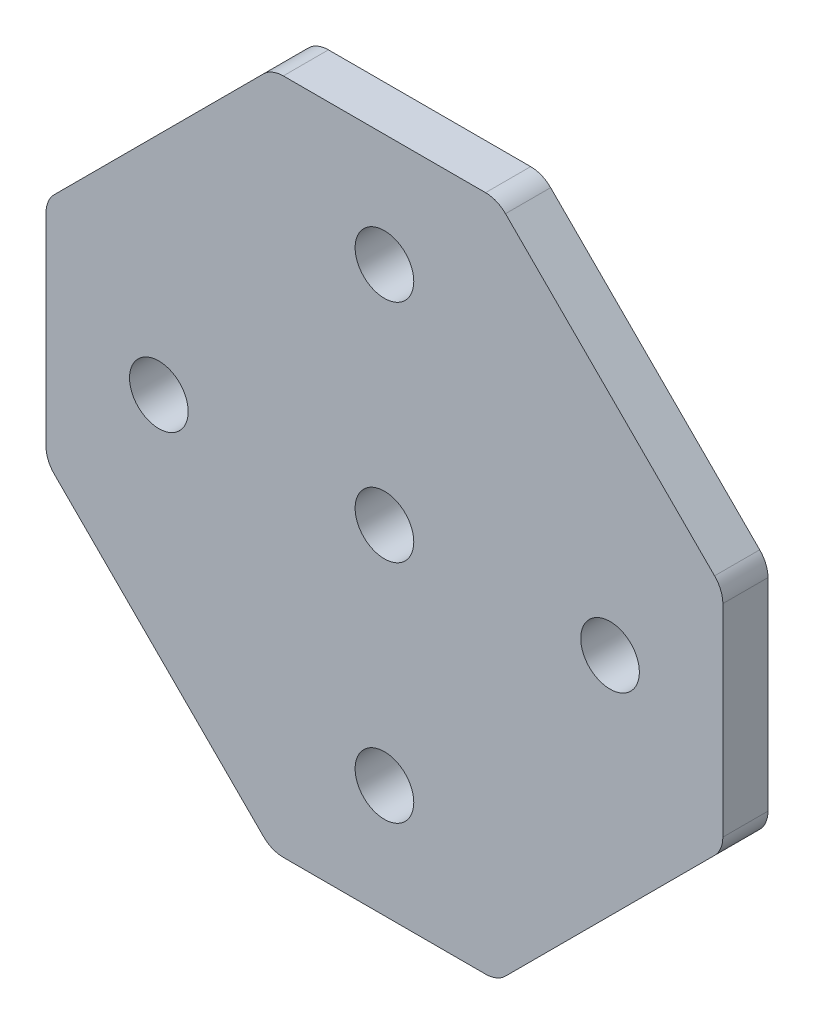
ISO-10303-21;
HEADER;
FILE_DESCRIPTION(('STEP AP214'),'2;1');
FILE_NAME('part.step','',(''),(''),'','','');
FILE_SCHEMA(('AUTOMOTIVE_DESIGN { 1 0 10303 214 1 1 1 1 }'));
ENDSEC;
DATA;
#1=APPLICATION_CONTEXT('core data for automotive mechanical design processes');
#2=APPLICATION_PROTOCOL_DEFINITION('international standard','automotive_design',2000,#1);
#3=PRODUCT_CONTEXT('',#1,'mechanical');
#4=PRODUCT('Part','Part','',(#3));
#5=PRODUCT_RELATED_PRODUCT_CATEGORY('part','',(#4));
#6=PRODUCT_DEFINITION_FORMATION('','',#4);
#7=PRODUCT_DEFINITION_CONTEXT('part definition',#1,'design');
#8=PRODUCT_DEFINITION('design','',#6,#7);
#9=PRODUCT_DEFINITION_SHAPE('','',#8);
#10=(LENGTH_UNIT() NAMED_UNIT(*) SI_UNIT(.MILLI.,.METRE.));
#11=(NAMED_UNIT(*) PLANE_ANGLE_UNIT() SI_UNIT($,.RADIAN.));
#12=(NAMED_UNIT(*) SI_UNIT($,.STERADIAN.) SOLID_ANGLE_UNIT());
#13=UNCERTAINTY_MEASURE_WITH_UNIT(LENGTH_MEASURE(1.E-05),#10,'distance_accuracy_value','');
#14=(GEOMETRIC_REPRESENTATION_CONTEXT(3) GLOBAL_UNCERTAINTY_ASSIGNED_CONTEXT((#13)) GLOBAL_UNIT_ASSIGNED_CONTEXT((#10,
#11,#12)) REPRESENTATION_CONTEXT('',''));
#15=CARTESIAN_POINT('',(0.,0.,0.));
#16=DIRECTION('',(0.,0.,1.));
#17=DIRECTION('',(1.,0.,0.));
#18=AXIS2_PLACEMENT_3D('',#15,#16,#17);
#19=CARTESIAN_POINT('',(2.5,1.03553390593274,4.));
#20=DIRECTION('',(0.,0.,1.));
#21=DIRECTION('',(1.,0.,0.));
#22=AXIS2_PLACEMENT_3D('',#19,#20,#21);
#23=PLANE('',#22);
#24=CARTESIAN_POINT('',(29.9999999999999,30.,4.));
#25=DIRECTION('',(0.,0.,1.));
#26=DIRECTION('',(1.,0.,0.));
#27=AXIS2_PLACEMENT_3D('',#24,#25,#26);
#28=CIRCLE('',#27,2.6);
#29=CARTESIAN_POINT('',(32.5999999999999,30.,4.));
#30=VERTEX_POINT('',#29);
#31=EDGE_CURVE('E400',#30,#30,#28,.T.);
#32=ORIENTED_EDGE('',*,*,#31,.F.);
#33=EDGE_LOOP('',(#32));
#34=FACE_BOUND('',#33,.T.);
#35=CARTESIAN_POINT('',(10.,10.,4.));
#36=DIRECTION('',(0.,0.,1.));
#37=DIRECTION('',(1.,0.,0.));
#38=AXIS2_PLACEMENT_3D('',#35,#36,#37);
#39=CIRCLE('',#38,2.6);
#40=CARTESIAN_POINT('',(12.6,10.,4.));
#41=VERTEX_POINT('',#40);
#42=EDGE_CURVE('E416',#41,#41,#39,.T.);
#43=ORIENTED_EDGE('',*,*,#42,.F.);
#44=EDGE_LOOP('',(#43));
#45=FACE_BOUND('',#44,.T.);
#46=CARTESIAN_POINT('',(2.5,1.03553390593274,4.));
#47=DIRECTION('',(0.,0.,1.));
#48=DIRECTION('',(1.,0.,0.));
#49=AXIS2_PLACEMENT_3D('',#46,#47,#48);
#50=CIRCLE('',#49,2.49999999999999);
#51=CARTESIAN_POINT('',(0.,1.03553390593276,4.));
#52=VERTEX_POINT('',#51);
#53=CARTESIAN_POINT('',(0.732233047033648,-0.732233047033627,4.));
#54=VERTEX_POINT('',#53);
#55=EDGE_CURVE('E236',#52,#54,#50,.T.);
#56=ORIENTED_EDGE('',*,*,#55,.T.);
#57=DIRECTION('',(0.707106781186555,-0.70710678118654,0.));
#58=VECTOR('',#57,1.);
#59=CARTESIAN_POINT('',(19.2677669529668,-19.2677669529664,4.));
#60=LINE('',#59,#58);
#61=CARTESIAN_POINT('',(19.2677669529667,-19.2677669529665,4.));
#62=VERTEX_POINT('',#61);
#63=EDGE_CURVE('E124',#54,#62,#60,.T.);
#64=ORIENTED_EDGE('',*,*,#63,.T.);
#65=CARTESIAN_POINT('',(21.0355339059327,-17.5,4.));
#66=DIRECTION('',(0.,0.,1.));
#67=DIRECTION('',(-1.,0.,0.));
#68=AXIS2_PLACEMENT_3D('',#65,#66,#67);
#69=CIRCLE('',#68,2.49999999999985);
#70=CARTESIAN_POINT('',(21.0355339059331,-20.,4.));
#71=VERTEX_POINT('',#70);
#72=EDGE_CURVE('E289',#62,#71,#69,.T.);
#73=ORIENTED_EDGE('',*,*,#72,.T.);
#74=DIRECTION('',(1.,0.,0.));
#75=VECTOR('',#74,1.);
#76=CARTESIAN_POINT('',(38.9644660940673,-20.,4.));
#77=LINE('',#76,#75);
#78=CARTESIAN_POINT('',(38.9644660940673,-20.,4.));
#79=VERTEX_POINT('',#78);
#80=EDGE_CURVE('E309',#71,#79,#77,.T.);
#81=ORIENTED_EDGE('',*,*,#80,.T.);
#82=CARTESIAN_POINT('',(38.9644660940673,-17.5,4.));
#83=DIRECTION('',(0.,0.,1.));
#84=DIRECTION('',(-1.,0.,0.));
#85=AXIS2_PLACEMENT_3D('',#82,#83,#84);
#86=CIRCLE('',#85,2.5);
#87=CARTESIAN_POINT('',(40.7322330470336,-19.2677669529664,4.));
#88=VERTEX_POINT('',#87);
#89=EDGE_CURVE('E305',#79,#88,#86,.T.);
#90=ORIENTED_EDGE('',*,*,#89,.T.);
#91=DIRECTION('',(0.707106781186548,0.707106781186547,0.));
#92=VECTOR('',#91,1.);
#93=CARTESIAN_POINT('',(59.2677669529664,-0.732233047033638,4.));
#94=LINE('',#93,#92);
#95=CARTESIAN_POINT('',(59.2677669529664,-0.732233047033639,4.));
#96=VERTEX_POINT('',#95);
#97=EDGE_CURVE('E308',#88,#96,#94,.T.);
#98=ORIENTED_EDGE('',*,*,#97,.T.);
#99=CARTESIAN_POINT('',(57.5,1.03553390593274,4.));
#100=DIRECTION('',(0.,0.,1.));
#101=DIRECTION('',(-1.,0.,0.));
#102=AXIS2_PLACEMENT_3D('',#99,#100,#101);
#103=CIRCLE('',#102,2.5);
#104=CARTESIAN_POINT('',(60.,1.03553390593275,4.));
#105=VERTEX_POINT('',#104);
#106=EDGE_CURVE('E313',#96,#105,#103,.T.);
#107=ORIENTED_EDGE('',*,*,#106,.T.);
#108=DIRECTION('',(0.,1.,0.));
#109=VECTOR('',#108,1.);
#110=CARTESIAN_POINT('',(60.,18.9644660940673,4.));
#111=LINE('',#110,#109);
#112=CARTESIAN_POINT('',(60.,18.9644660940673,4.));
#113=VERTEX_POINT('',#112);
#114=EDGE_CURVE('E320',#105,#113,#111,.T.);
#115=ORIENTED_EDGE('',*,*,#114,.T.);
#116=CARTESIAN_POINT('',(57.5,18.9644660940673,4.));
#117=DIRECTION('',(0.,0.,1.));
#118=DIRECTION('',(-1.,0.,0.));
#119=AXIS2_PLACEMENT_3D('',#116,#117,#118);
#120=CIRCLE('',#119,2.5);
#121=CARTESIAN_POINT('',(59.2677669529664,20.7322330470336,4.));
#122=VERTEX_POINT('',#121);
#123=EDGE_CURVE('E323',#113,#122,#120,.T.);
#124=ORIENTED_EDGE('',*,*,#123,.T.);
#125=DIRECTION('',(-0.707106781186547,0.707106781186547,0.));
#126=VECTOR('',#125,1.);
#127=CARTESIAN_POINT('',(40.7322330470336,39.2677669529664,4.));
#128=LINE('',#127,#126);
#129=CARTESIAN_POINT('',(40.7322330470336,39.2677669529664,4.));
#130=VERTEX_POINT('',#129);
#131=EDGE_CURVE('E326',#122,#130,#128,.T.);
#132=ORIENTED_EDGE('',*,*,#131,.T.);
#133=CARTESIAN_POINT('',(38.9644660940673,37.5,4.));
#134=DIRECTION('',(0.,0.,1.));
#135=DIRECTION('',(-1.,0.,0.));
#136=AXIS2_PLACEMENT_3D('',#133,#134,#135);
#137=CIRCLE('',#136,2.5);
#138=CARTESIAN_POINT('',(38.9644660940673,40.,4.));
#139=VERTEX_POINT('',#138);
#140=EDGE_CURVE('E329',#130,#139,#137,.T.);
#141=ORIENTED_EDGE('',*,*,#140,.T.);
#142=DIRECTION('',(-1.,0.,0.));
#143=VECTOR('',#142,1.);
#144=CARTESIAN_POINT('',(21.0355339059331,40.,4.));
#145=LINE('',#144,#143);
#146=CARTESIAN_POINT('',(21.0355339059331,39.9999999999999,4.));
#147=VERTEX_POINT('',#146);
#148=EDGE_CURVE('E332',#139,#147,#145,.T.);
#149=ORIENTED_EDGE('',*,*,#148,.T.);
#150=CARTESIAN_POINT('',(21.0355339059327,37.5,4.));
#151=DIRECTION('',(0.,0.,1.));
#152=DIRECTION('',(-1.,0.,0.));
#153=AXIS2_PLACEMENT_3D('',#150,#151,#152);
#154=CIRCLE('',#153,2.49999999999986);
#155=CARTESIAN_POINT('',(19.2677669529668,39.2677669529664,4.));
#156=VERTEX_POINT('',#155);
#157=EDGE_CURVE('E167',#147,#156,#154,.T.);
#158=ORIENTED_EDGE('',*,*,#157,.T.);
#159=DIRECTION('',(-0.707106781186555,-0.70710678118654,0.));
#160=VECTOR('',#159,1.);
#161=CARTESIAN_POINT('',(0.73223304703365,20.7322330470336,4.));
#162=LINE('',#161,#160);
#163=CARTESIAN_POINT('',(0.73223304703365,20.7322330470336,4.));
#164=VERTEX_POINT('',#163);
#165=EDGE_CURVE('E161',#156,#164,#162,.T.);
#166=ORIENTED_EDGE('',*,*,#165,.T.);
#167=CARTESIAN_POINT('',(2.5,18.9644660940673,4.));
#168=DIRECTION('',(0.,0.,1.));
#169=DIRECTION('',(-1.,0.,0.));
#170=AXIS2_PLACEMENT_3D('',#167,#168,#169);
#171=CIRCLE('',#170,2.5);
#172=CARTESIAN_POINT('',(0.,18.9644660940673,4.));
#173=VERTEX_POINT('',#172);
#174=EDGE_CURVE('E165',#164,#173,#171,.T.);
#175=ORIENTED_EDGE('',*,*,#174,.T.);
#176=DIRECTION('',(0.,-1.,0.));
#177=VECTOR('',#176,1.);
#178=CARTESIAN_POINT('',(0.,1.03553390593276,4.));
#179=LINE('',#178,#177);
#180=EDGE_CURVE('E57',#173,#52,#179,.T.);
#181=ORIENTED_EDGE('',*,*,#180,.T.);
#182=EDGE_LOOP('',(#56,#64,#73,#81,#90,#98,#107,#115,#124,#132,#141,#149,#158,#166,#175,#181));
#183=FACE_BOUND('',#182,.T.);
#184=CARTESIAN_POINT('',(30.,10.,4.));
#185=DIRECTION('',(0.,0.,1.));
#186=DIRECTION('',(1.,0.,0.));
#187=AXIS2_PLACEMENT_3D('',#184,#185,#186);
#188=CIRCLE('',#187,2.6);
#189=CARTESIAN_POINT('',(32.6,10.,4.));
#190=VERTEX_POINT('',#189);
#191=EDGE_CURVE('E194',#190,#190,#188,.T.);
#192=ORIENTED_EDGE('',*,*,#191,.F.);
#193=EDGE_LOOP('',(#192));
#194=FACE_BOUND('',#193,.T.);
#195=CARTESIAN_POINT('',(50.,10.,4.));
#196=DIRECTION('',(0.,0.,1.));
#197=DIRECTION('',(1.,0.,0.));
#198=AXIS2_PLACEMENT_3D('',#195,#196,#197);
#199=CIRCLE('',#198,2.6);
#200=CARTESIAN_POINT('',(52.6,10.,4.));
#201=VERTEX_POINT('',#200);
#202=EDGE_CURVE('E408',#201,#201,#199,.T.);
#203=ORIENTED_EDGE('',*,*,#202,.F.);
#204=EDGE_LOOP('',(#203));
#205=FACE_BOUND('',#204,.T.);
#206=CARTESIAN_POINT('',(30.0000000000002,-10.,4.));
#207=DIRECTION('',(0.,0.,1.));
#208=DIRECTION('',(1.,0.,0.));
#209=AXIS2_PLACEMENT_3D('',#206,#207,#208);
#210=CIRCLE('',#209,2.6);
#211=CARTESIAN_POINT('',(32.6000000000002,-10.,4.));
#212=VERTEX_POINT('',#211);
#213=EDGE_CURVE('E389',#212,#212,#210,.T.);
#214=ORIENTED_EDGE('',*,*,#213,.F.);
#215=EDGE_LOOP('',(#214));
#216=FACE_BOUND('',#215,.T.);
#217=ADVANCED_FACE('F39',(#34,#45,#183,#194,#205,#216),#23,.T.);
#218=CARTESIAN_POINT('',(2.5,1.03553390593274,0.));
#219=DIRECTION('',(0.,0.,1.));
#220=DIRECTION('',(1.,0.,0.));
#221=AXIS2_PLACEMENT_3D('',#218,#219,#220);
#222=PLANE('',#221);
#223=CARTESIAN_POINT('',(2.5,1.03553390593274,0.));
#224=DIRECTION('',(0.,0.,1.));
#225=DIRECTION('',(1.,0.,0.));
#226=AXIS2_PLACEMENT_3D('',#223,#224,#225);
#227=CIRCLE('',#226,2.49999999999999);
#228=CARTESIAN_POINT('',(0.,1.03553390593276,0.));
#229=VERTEX_POINT('',#228);
#230=CARTESIAN_POINT('',(0.732233047033648,-0.732233047033627,0.));
#231=VERTEX_POINT('',#230);
#232=EDGE_CURVE('E189',#229,#231,#227,.T.);
#233=ORIENTED_EDGE('',*,*,#232,.F.);
#234=DIRECTION('',(0.,-1.,0.));
#235=VECTOR('',#234,1.);
#236=CARTESIAN_POINT('',(0.,1.03553390593276,0.));
#237=LINE('',#236,#235);
#238=CARTESIAN_POINT('',(0.,18.9644660940673,0.));
#239=VERTEX_POINT('',#238);
#240=EDGE_CURVE('E116',#239,#229,#237,.T.);
#241=ORIENTED_EDGE('',*,*,#240,.F.);
#242=CARTESIAN_POINT('',(2.5,18.9644660940673,0.));
#243=DIRECTION('',(0.,0.,1.));
#244=DIRECTION('',(-1.,0.,0.));
#245=AXIS2_PLACEMENT_3D('',#242,#243,#244);
#246=CIRCLE('',#245,2.5);
#247=CARTESIAN_POINT('',(0.73223304703365,20.7322330470336,0.));
#248=VERTEX_POINT('',#247);
#249=EDGE_CURVE('E110',#248,#239,#246,.T.);
#250=ORIENTED_EDGE('',*,*,#249,.F.);
#251=DIRECTION('',(-0.707106781186555,-0.70710678118654,0.));
#252=VECTOR('',#251,1.);
#253=CARTESIAN_POINT('',(0.73223304703365,20.7322330470336,0.));
#254=LINE('',#253,#252);
#255=CARTESIAN_POINT('',(19.2677669529668,39.2677669529664,0.));
#256=VERTEX_POINT('',#255);
#257=EDGE_CURVE('E176',#256,#248,#254,.T.);
#258=ORIENTED_EDGE('',*,*,#257,.F.);
#259=CARTESIAN_POINT('',(21.0355339059327,37.5,0.));
#260=DIRECTION('',(0.,0.,1.));
#261=DIRECTION('',(-1.,0.,0.));
#262=AXIS2_PLACEMENT_3D('',#259,#260,#261);
#263=CIRCLE('',#262,2.49999999999986);
#264=CARTESIAN_POINT('',(21.0355339059331,39.9999999999999,0.));
#265=VERTEX_POINT('',#264);
#266=EDGE_CURVE('E227',#265,#256,#263,.T.);
#267=ORIENTED_EDGE('',*,*,#266,.F.);
#268=DIRECTION('',(-1.,0.,0.));
#269=VECTOR('',#268,1.);
#270=CARTESIAN_POINT('',(21.0355339059331,40.,0.));
#271=LINE('',#270,#269);
#272=CARTESIAN_POINT('',(38.9644660940673,40.,0.));
#273=VERTEX_POINT('',#272);
#274=EDGE_CURVE('E224',#273,#265,#271,.T.);
#275=ORIENTED_EDGE('',*,*,#274,.F.);
#276=CARTESIAN_POINT('',(38.9644660940673,37.5,0.));
#277=DIRECTION('',(0.,0.,1.));
#278=DIRECTION('',(-1.,0.,0.));
#279=AXIS2_PLACEMENT_3D('',#276,#277,#278);
#280=CIRCLE('',#279,2.5);
#281=CARTESIAN_POINT('',(40.7322330470336,39.2677669529664,0.));
#282=VERTEX_POINT('',#281);
#283=EDGE_CURVE('E221',#282,#273,#280,.T.);
#284=ORIENTED_EDGE('',*,*,#283,.F.);
#285=DIRECTION('',(-0.707106781186547,0.707106781186547,0.));
#286=VECTOR('',#285,1.);
#287=CARTESIAN_POINT('',(40.7322330470336,39.2677669529664,0.));
#288=LINE('',#287,#286);
#289=CARTESIAN_POINT('',(59.2677669529664,20.7322330470336,0.));
#290=VERTEX_POINT('',#289);
#291=EDGE_CURVE('E218',#290,#282,#288,.T.);
#292=ORIENTED_EDGE('',*,*,#291,.F.);
#293=CARTESIAN_POINT('',(57.5,18.9644660940673,0.));
#294=DIRECTION('',(0.,0.,1.));
#295=DIRECTION('',(-1.,0.,0.));
#296=AXIS2_PLACEMENT_3D('',#293,#294,#295);
#297=CIRCLE('',#296,2.5);
#298=CARTESIAN_POINT('',(60.,18.9644660940673,0.));
#299=VERTEX_POINT('',#298);
#300=EDGE_CURVE('E215',#299,#290,#297,.T.);
#301=ORIENTED_EDGE('',*,*,#300,.F.);
#302=DIRECTION('',(0.,1.,0.));
#303=VECTOR('',#302,1.);
#304=CARTESIAN_POINT('',(60.,18.9644660940673,0.));
#305=LINE('',#304,#303);
#306=CARTESIAN_POINT('',(60.,1.03553390593275,0.));
#307=VERTEX_POINT('',#306);
#308=EDGE_CURVE('E212',#307,#299,#305,.T.);
#309=ORIENTED_EDGE('',*,*,#308,.F.);
#310=CARTESIAN_POINT('',(57.5,1.03553390593274,0.));
#311=DIRECTION('',(0.,0.,1.));
#312=DIRECTION('',(-1.,0.,0.));
#313=AXIS2_PLACEMENT_3D('',#310,#311,#312);
#314=CIRCLE('',#313,2.5);
#315=CARTESIAN_POINT('',(59.2677669529664,-0.732233047033639,0.));
#316=VERTEX_POINT('',#315);
#317=EDGE_CURVE('E209',#316,#307,#314,.T.);
#318=ORIENTED_EDGE('',*,*,#317,.F.);
#319=DIRECTION('',(0.707106781186548,0.707106781186547,0.));
#320=VECTOR('',#319,1.);
#321=CARTESIAN_POINT('',(59.2677669529664,-0.732233047033638,0.));
#322=LINE('',#321,#320);
#323=CARTESIAN_POINT('',(40.7322330470336,-19.2677669529664,0.));
#324=VERTEX_POINT('',#323);
#325=EDGE_CURVE('E206',#324,#316,#322,.T.);
#326=ORIENTED_EDGE('',*,*,#325,.F.);
#327=CARTESIAN_POINT('',(38.9644660940673,-17.5,0.));
#328=DIRECTION('',(0.,0.,1.));
#329=DIRECTION('',(-1.,0.,0.));
#330=AXIS2_PLACEMENT_3D('',#327,#328,#329);
#331=CIRCLE('',#330,2.5);
#332=CARTESIAN_POINT('',(38.9644660940673,-20.,0.));
#333=VERTEX_POINT('',#332);
#334=EDGE_CURVE('E203',#333,#324,#331,.T.);
#335=ORIENTED_EDGE('',*,*,#334,.F.);
#336=DIRECTION('',(1.,0.,0.));
#337=VECTOR('',#336,1.);
#338=CARTESIAN_POINT('',(38.9644660940673,-20.,0.));
#339=LINE('',#338,#337);
#340=CARTESIAN_POINT('',(21.0355339059331,-20.,0.));
#341=VERTEX_POINT('',#340);
#342=EDGE_CURVE('E200',#341,#333,#339,.T.);
#343=ORIENTED_EDGE('',*,*,#342,.F.);
#344=CARTESIAN_POINT('',(21.0355339059327,-17.5,0.));
#345=DIRECTION('',(0.,0.,1.));
#346=DIRECTION('',(-1.,0.,0.));
#347=AXIS2_PLACEMENT_3D('',#344,#345,#346);
#348=CIRCLE('',#347,2.49999999999985);
#349=CARTESIAN_POINT('',(19.2677669529667,-19.2677669529665,0.));
#350=VERTEX_POINT('',#349);
#351=EDGE_CURVE('E197',#350,#341,#348,.T.);
#352=ORIENTED_EDGE('',*,*,#351,.F.);
#353=DIRECTION('',(0.707106781186555,-0.70710678118654,0.));
#354=VECTOR('',#353,1.);
#355=CARTESIAN_POINT('',(19.2677669529668,-19.2677669529664,0.));
#356=LINE('',#355,#354);
#357=EDGE_CURVE('E193',#231,#350,#356,.T.);
#358=ORIENTED_EDGE('',*,*,#357,.F.);
#359=EDGE_LOOP('',(#233,#241,#250,#258,#267,#275,#284,#292,#301,#309,#318,#326,#335,#343,#352,#358));
#360=FACE_BOUND('',#359,.T.);
#361=CARTESIAN_POINT('',(30.,10.,0.));
#362=DIRECTION('',(0.,0.,1.));
#363=DIRECTION('',(1.,0.,0.));
#364=AXIS2_PLACEMENT_3D('',#361,#362,#363);
#365=CIRCLE('',#364,2.6);
#366=CARTESIAN_POINT('',(32.6,10.,0.));
#367=VERTEX_POINT('',#366);
#368=EDGE_CURVE('E420',#367,#367,#365,.T.);
#369=ORIENTED_EDGE('',*,*,#368,.T.);
#370=EDGE_LOOP('',(#369));
#371=FACE_BOUND('',#370,.T.);
#372=CARTESIAN_POINT('',(10.,10.,0.));
#373=DIRECTION('',(0.,0.,1.));
#374=DIRECTION('',(1.,0.,0.));
#375=AXIS2_PLACEMENT_3D('',#372,#373,#374);
#376=CIRCLE('',#375,2.6);
#377=CARTESIAN_POINT('',(12.6,10.,0.));
#378=VERTEX_POINT('',#377);
#379=EDGE_CURVE('E412',#378,#378,#376,.T.);
#380=ORIENTED_EDGE('',*,*,#379,.T.);
#381=EDGE_LOOP('',(#380));
#382=FACE_BOUND('',#381,.T.);
#383=CARTESIAN_POINT('',(50.,10.,0.));
#384=DIRECTION('',(0.,0.,1.));
#385=DIRECTION('',(1.,0.,0.));
#386=AXIS2_PLACEMENT_3D('',#383,#384,#385);
#387=CIRCLE('',#386,2.6);
#388=CARTESIAN_POINT('',(52.6,10.,0.));
#389=VERTEX_POINT('',#388);
#390=EDGE_CURVE('E404',#389,#389,#387,.T.);
#391=ORIENTED_EDGE('',*,*,#390,.T.);
#392=EDGE_LOOP('',(#391));
#393=FACE_BOUND('',#392,.T.);
#394=CARTESIAN_POINT('',(29.9999999999999,30.,0.));
#395=DIRECTION('',(0.,0.,1.));
#396=DIRECTION('',(1.,0.,0.));
#397=AXIS2_PLACEMENT_3D('',#394,#395,#396);
#398=CIRCLE('',#397,2.6);
#399=CARTESIAN_POINT('',(32.5999999999999,30.,0.));
#400=VERTEX_POINT('',#399);
#401=EDGE_CURVE('E397',#400,#400,#398,.T.);
#402=ORIENTED_EDGE('',*,*,#401,.T.);
#403=EDGE_LOOP('',(#402));
#404=FACE_BOUND('',#403,.T.);
#405=CARTESIAN_POINT('',(30.0000000000002,-10.,0.));
#406=DIRECTION('',(0.,0.,1.));
#407=DIRECTION('',(1.,0.,0.));
#408=AXIS2_PLACEMENT_3D('',#405,#406,#407);
#409=CIRCLE('',#408,2.6);
#410=CARTESIAN_POINT('',(32.6000000000002,-10.,0.));
#411=VERTEX_POINT('',#410);
#412=EDGE_CURVE('E392',#411,#411,#409,.T.);
#413=ORIENTED_EDGE('',*,*,#412,.T.);
#414=EDGE_LOOP('',(#413));
#415=FACE_BOUND('',#414,.T.);
#416=ADVANCED_FACE('F293',(#360,#371,#382,#393,#404,#415),#222,.F.);
#417=CARTESIAN_POINT('',(2.5,1.03553390593274,4.));
#418=DIRECTION('',(0.,0.,-1.));
#419=DIRECTION('',(-1.,0.,0.));
#420=AXIS2_PLACEMENT_3D('',#417,#418,#419);
#421=CYLINDRICAL_SURFACE('',#420,2.49999999999999);
#422=ORIENTED_EDGE('',*,*,#232,.T.);
#423=DIRECTION('',(0.,0.,-1.));
#424=VECTOR('',#423,1.);
#425=CARTESIAN_POINT('',(0.732233047033648,-0.732233047033627,4.));
#426=LINE('',#425,#424);
#427=EDGE_CURVE('E11',#54,#231,#426,.T.);
#428=ORIENTED_EDGE('',*,*,#427,.F.);
#429=ORIENTED_EDGE('',*,*,#55,.F.);
#430=DIRECTION('',(0.,0.,-1.));
#431=VECTOR('',#430,1.);
#432=CARTESIAN_POINT('',(0.,1.03553390593276,4.));
#433=LINE('',#432,#431);
#434=EDGE_CURVE('E185',#52,#229,#433,.T.);
#435=ORIENTED_EDGE('',*,*,#434,.T.);
#436=EDGE_LOOP('',(#422,#428,#429,#435));
#437=FACE_BOUND('',#436,.T.);
#438=ADVANCED_FACE('F41',(#437),#421,.T.);
#439=CARTESIAN_POINT('',(19.2677669529668,-19.2677669529664,4.));
#440=DIRECTION('',(0.70710678118654,0.707106781186555,0.));
#441=DIRECTION('',(-0.707106781186555,0.70710678118654,0.));
#442=AXIS2_PLACEMENT_3D('',#439,#440,#441);
#443=PLANE('',#442);
#444=ORIENTED_EDGE('',*,*,#357,.T.);
#445=DIRECTION('',(0.,0.,-1.));
#446=VECTOR('',#445,1.);
#447=CARTESIAN_POINT('',(19.2677669529667,-19.2677669529665,4.));
#448=LINE('',#447,#446);
#449=EDGE_CURVE('E49',#62,#350,#448,.T.);
#450=ORIENTED_EDGE('',*,*,#449,.F.);
#451=ORIENTED_EDGE('',*,*,#63,.F.);
#452=ORIENTED_EDGE('',*,*,#427,.T.);
#453=EDGE_LOOP('',(#444,#450,#451,#452));
#454=FACE_BOUND('',#453,.T.);
#455=ADVANCED_FACE('F585',(#454),#443,.F.);
#456=CARTESIAN_POINT('',(21.0355339059327,-17.5,4.));
#457=DIRECTION('',(0.,0.,-1.));
#458=DIRECTION('',(-1.,0.,0.));
#459=AXIS2_PLACEMENT_3D('',#456,#457,#458);
#460=CYLINDRICAL_SURFACE('',#459,2.49999999999985);
#461=ORIENTED_EDGE('',*,*,#351,.T.);
#462=DIRECTION('',(0.,0.,-1.));
#463=VECTOR('',#462,1.);
#464=CARTESIAN_POINT('',(21.0355339059331,-20.,4.));
#465=LINE('',#464,#463);
#466=EDGE_CURVE('E279',#71,#341,#465,.T.);
#467=ORIENTED_EDGE('',*,*,#466,.F.);
#468=ORIENTED_EDGE('',*,*,#72,.F.);
#469=ORIENTED_EDGE('',*,*,#449,.T.);
#470=EDGE_LOOP('',(#461,#467,#468,#469));
#471=FACE_BOUND('',#470,.T.);
#472=ADVANCED_FACE('F287',(#471),#460,.T.);
#473=CARTESIAN_POINT('',(38.9644660940673,-20.,4.));
#474=DIRECTION('',(0.,1.,0.));
#475=DIRECTION('',(-1.,0.,0.));
#476=AXIS2_PLACEMENT_3D('',#473,#474,#475);
#477=PLANE('',#476);
#478=ORIENTED_EDGE('',*,*,#342,.T.);
#479=DIRECTION('',(0.,0.,-1.));
#480=VECTOR('',#479,1.);
#481=CARTESIAN_POINT('',(38.9644660940673,-20.,4.));
#482=LINE('',#481,#480);
#483=EDGE_CURVE('E275',#79,#333,#482,.T.);
#484=ORIENTED_EDGE('',*,*,#483,.F.);
#485=ORIENTED_EDGE('',*,*,#80,.F.);
#486=ORIENTED_EDGE('',*,*,#466,.T.);
#487=EDGE_LOOP('',(#478,#484,#485,#486));
#488=FACE_BOUND('',#487,.T.);
#489=ADVANCED_FACE('F299',(#488),#477,.F.);
#490=CARTESIAN_POINT('',(38.9644660940673,-17.5,4.));
#491=DIRECTION('',(0.,0.,-1.));
#492=DIRECTION('',(-1.,0.,0.));
#493=AXIS2_PLACEMENT_3D('',#490,#491,#492);
#494=CYLINDRICAL_SURFACE('',#493,2.5);
#495=ORIENTED_EDGE('',*,*,#334,.T.);
#496=DIRECTION('',(0.,0.,-1.));
#497=VECTOR('',#496,1.);
#498=CARTESIAN_POINT('',(40.7322330470336,-19.2677669529664,4.));
#499=LINE('',#498,#497);
#500=EDGE_CURVE('E271',#88,#324,#499,.T.);
#501=ORIENTED_EDGE('',*,*,#500,.F.);
#502=ORIENTED_EDGE('',*,*,#89,.F.);
#503=ORIENTED_EDGE('',*,*,#483,.T.);
#504=EDGE_LOOP('',(#495,#501,#502,#503));
#505=FACE_BOUND('',#504,.T.);
#506=ADVANCED_FACE('F303',(#505),#494,.T.);
#507=CARTESIAN_POINT('',(59.2677669529664,-0.732233047033638,4.));
#508=DIRECTION('',(-0.707106781186547,0.707106781186548,0.));
#509=DIRECTION('',(-0.707106781186548,-0.707106781186547,0.));
#510=AXIS2_PLACEMENT_3D('',#507,#508,#509);
#511=PLANE('',#510);
#512=ORIENTED_EDGE('',*,*,#325,.T.);
#513=DIRECTION('',(0.,0.,-1.));
#514=VECTOR('',#513,1.);
#515=CARTESIAN_POINT('',(59.2677669529664,-0.732233047033639,4.));
#516=LINE('',#515,#514);
#517=EDGE_CURVE('E267',#96,#316,#516,.T.);
#518=ORIENTED_EDGE('',*,*,#517,.F.);
#519=ORIENTED_EDGE('',*,*,#97,.F.);
#520=ORIENTED_EDGE('',*,*,#500,.T.);
#521=EDGE_LOOP('',(#512,#518,#519,#520));
#522=FACE_BOUND('',#521,.T.);
#523=ADVANCED_FACE('F550',(#522),#511,.F.);
#524=CARTESIAN_POINT('',(57.5,1.03553390593274,4.));
#525=DIRECTION('',(0.,0.,-1.));
#526=DIRECTION('',(-1.,0.,0.));
#527=AXIS2_PLACEMENT_3D('',#524,#525,#526);
#528=CYLINDRICAL_SURFACE('',#527,2.5);
#529=ORIENTED_EDGE('',*,*,#317,.T.);
#530=DIRECTION('',(0.,0.,-1.));
#531=VECTOR('',#530,1.);
#532=CARTESIAN_POINT('',(60.,1.03553390593275,4.));
#533=LINE('',#532,#531);
#534=EDGE_CURVE('E263',#105,#307,#533,.T.);
#535=ORIENTED_EDGE('',*,*,#534,.F.);
#536=ORIENTED_EDGE('',*,*,#106,.F.);
#537=ORIENTED_EDGE('',*,*,#517,.T.);
#538=EDGE_LOOP('',(#529,#535,#536,#537));
#539=FACE_BOUND('',#538,.T.);
#540=ADVANCED_FACE('F540',(#539),#528,.T.);
#541=CARTESIAN_POINT('',(60.,18.9644660940673,4.));
#542=DIRECTION('',(-1.,0.,0.));
#543=DIRECTION('',(0.,0.,1.));
#544=AXIS2_PLACEMENT_3D('',#541,#542,#543);
#545=PLANE('',#544);
#546=ORIENTED_EDGE('',*,*,#308,.T.);
#547=DIRECTION('',(0.,0.,-1.));
#548=VECTOR('',#547,1.);
#549=CARTESIAN_POINT('',(60.,18.9644660940673,4.));
#550=LINE('',#549,#548);
#551=EDGE_CURVE('E259',#113,#299,#550,.T.);
#552=ORIENTED_EDGE('',*,*,#551,.F.);
#553=ORIENTED_EDGE('',*,*,#114,.F.);
#554=ORIENTED_EDGE('',*,*,#534,.T.);
#555=EDGE_LOOP('',(#546,#552,#553,#554));
#556=FACE_BOUND('',#555,.T.);
#557=ADVANCED_FACE('F530',(#556),#545,.F.);
#558=CARTESIAN_POINT('',(57.5,18.9644660940673,4.));
#559=DIRECTION('',(0.,0.,-1.));
#560=DIRECTION('',(-1.,0.,0.));
#561=AXIS2_PLACEMENT_3D('',#558,#559,#560);
#562=CYLINDRICAL_SURFACE('',#561,2.5);
#563=ORIENTED_EDGE('',*,*,#300,.T.);
#564=DIRECTION('',(0.,0.,-1.));
#565=VECTOR('',#564,1.);
#566=CARTESIAN_POINT('',(59.2677669529664,20.7322330470336,4.));
#567=LINE('',#566,#565);
#568=EDGE_CURVE('E255',#122,#290,#567,.T.);
#569=ORIENTED_EDGE('',*,*,#568,.F.);
#570=ORIENTED_EDGE('',*,*,#123,.F.);
#571=ORIENTED_EDGE('',*,*,#551,.T.);
#572=EDGE_LOOP('',(#563,#569,#570,#571));
#573=FACE_BOUND('',#572,.T.);
#574=ADVANCED_FACE('F520',(#573),#562,.T.);
#575=CARTESIAN_POINT('',(40.7322330470336,39.2677669529664,4.));
#576=DIRECTION('',(-0.707106781186547,-0.707106781186547,0.));
#577=DIRECTION('',(0.707106781186548,-0.707106781186548,0.));
#578=AXIS2_PLACEMENT_3D('',#575,#576,#577);
#579=PLANE('',#578);
#580=ORIENTED_EDGE('',*,*,#291,.T.);
#581=DIRECTION('',(0.,0.,-1.));
#582=VECTOR('',#581,1.);
#583=CARTESIAN_POINT('',(40.7322330470336,39.2677669529664,4.));
#584=LINE('',#583,#582);
#585=EDGE_CURVE('E251',#130,#282,#584,.T.);
#586=ORIENTED_EDGE('',*,*,#585,.F.);
#587=ORIENTED_EDGE('',*,*,#131,.F.);
#588=ORIENTED_EDGE('',*,*,#568,.T.);
#589=EDGE_LOOP('',(#580,#586,#587,#588));
#590=FACE_BOUND('',#589,.T.);
#591=ADVANCED_FACE('F510',(#590),#579,.F.);
#592=CARTESIAN_POINT('',(38.9644660940673,37.5,4.));
#593=DIRECTION('',(0.,0.,-1.));
#594=DIRECTION('',(-1.,0.,0.));
#595=AXIS2_PLACEMENT_3D('',#592,#593,#594);
#596=CYLINDRICAL_SURFACE('',#595,2.5);
#597=ORIENTED_EDGE('',*,*,#283,.T.);
#598=DIRECTION('',(0.,0.,-1.));
#599=VECTOR('',#598,1.);
#600=CARTESIAN_POINT('',(38.9644660940673,40.,4.));
#601=LINE('',#600,#599);
#602=EDGE_CURVE('E247',#139,#273,#601,.T.);
#603=ORIENTED_EDGE('',*,*,#602,.F.);
#604=ORIENTED_EDGE('',*,*,#140,.F.);
#605=ORIENTED_EDGE('',*,*,#585,.T.);
#606=EDGE_LOOP('',(#597,#603,#604,#605));
#607=FACE_BOUND('',#606,.T.);
#608=ADVANCED_FACE('F501',(#607),#596,.T.);
#609=CARTESIAN_POINT('',(21.0355339059331,40.,4.));
#610=DIRECTION('',(0.,-1.,0.));
#611=DIRECTION('',(0.,0.,-1.));
#612=AXIS2_PLACEMENT_3D('',#609,#610,#611);
#613=PLANE('',#612);
#614=ORIENTED_EDGE('',*,*,#274,.T.);
#615=DIRECTION('',(0.,0.,-1.));
#616=VECTOR('',#615,1.);
#617=CARTESIAN_POINT('',(21.0355339059331,39.9999999999999,4.));
#618=LINE('',#617,#616);
#619=EDGE_CURVE('E243',#147,#265,#618,.T.);
#620=ORIENTED_EDGE('',*,*,#619,.F.);
#621=ORIENTED_EDGE('',*,*,#148,.F.);
#622=ORIENTED_EDGE('',*,*,#602,.T.);
#623=EDGE_LOOP('',(#614,#620,#621,#622));
#624=FACE_BOUND('',#623,.T.);
#625=ADVANCED_FACE('F340',(#624),#613,.F.);
#626=CARTESIAN_POINT('',(21.0355339059327,37.5,4.));
#627=DIRECTION('',(0.,0.,-1.));
#628=DIRECTION('',(-1.,0.,0.));
#629=AXIS2_PLACEMENT_3D('',#626,#627,#628);
#630=CYLINDRICAL_SURFACE('',#629,2.49999999999986);
#631=ORIENTED_EDGE('',*,*,#266,.T.);
#632=DIRECTION('',(0.,0.,-1.));
#633=VECTOR('',#632,1.);
#634=CARTESIAN_POINT('',(19.2677669529668,39.2677669529664,4.));
#635=LINE('',#634,#633);
#636=EDGE_CURVE('E178',#156,#256,#635,.T.);
#637=ORIENTED_EDGE('',*,*,#636,.F.);
#638=ORIENTED_EDGE('',*,*,#157,.F.);
#639=ORIENTED_EDGE('',*,*,#619,.T.);
#640=EDGE_LOOP('',(#631,#637,#638,#639));
#641=FACE_BOUND('',#640,.T.);
#642=ADVANCED_FACE('F344',(#641),#630,.T.);
#643=CARTESIAN_POINT('',(0.73223304703365,20.7322330470336,4.));
#644=DIRECTION('',(0.70710678118654,-0.707106781186555,0.));
#645=DIRECTION('',(0.707106781186555,0.70710678118654,0.));
#646=AXIS2_PLACEMENT_3D('',#643,#644,#645);
#647=PLANE('',#646);
#648=ORIENTED_EDGE('',*,*,#257,.T.);
#649=DIRECTION('',(0.,0.,-1.));
#650=VECTOR('',#649,1.);
#651=CARTESIAN_POINT('',(0.73223304703365,20.7322330470336,4.));
#652=LINE('',#651,#650);
#653=EDGE_CURVE('E173',#164,#248,#652,.T.);
#654=ORIENTED_EDGE('',*,*,#653,.F.);
#655=ORIENTED_EDGE('',*,*,#165,.F.);
#656=ORIENTED_EDGE('',*,*,#636,.T.);
#657=EDGE_LOOP('',(#648,#654,#655,#656));
#658=FACE_BOUND('',#657,.T.);
#659=ADVANCED_FACE('F174',(#658),#647,.F.);
#660=CARTESIAN_POINT('',(2.5,18.9644660940673,4.));
#661=DIRECTION('',(0.,0.,-1.));
#662=DIRECTION('',(-1.,0.,0.));
#663=AXIS2_PLACEMENT_3D('',#660,#661,#662);
#664=CYLINDRICAL_SURFACE('',#663,2.5);
#665=ORIENTED_EDGE('',*,*,#249,.T.);
#666=DIRECTION('',(0.,0.,-1.));
#667=VECTOR('',#666,1.);
#668=CARTESIAN_POINT('',(0.,18.9644660940673,4.));
#669=LINE('',#668,#667);
#670=EDGE_CURVE('E179',#173,#239,#669,.T.);
#671=ORIENTED_EDGE('',*,*,#670,.F.);
#672=ORIENTED_EDGE('',*,*,#174,.F.);
#673=ORIENTED_EDGE('',*,*,#653,.T.);
#674=EDGE_LOOP('',(#665,#671,#672,#673));
#675=FACE_BOUND('',#674,.T.);
#676=ADVANCED_FACE('F181',(#675),#664,.T.);
#677=CARTESIAN_POINT('',(0.,1.03553390593276,4.));
#678=DIRECTION('',(1.,0.,0.));
#679=DIRECTION('',(0.,0.,-1.));
#680=AXIS2_PLACEMENT_3D('',#677,#678,#679);
#681=PLANE('',#680);
#682=ORIENTED_EDGE('',*,*,#240,.T.);
#683=ORIENTED_EDGE('',*,*,#434,.F.);
#684=ORIENTED_EDGE('',*,*,#180,.F.);
#685=ORIENTED_EDGE('',*,*,#670,.T.);
#686=EDGE_LOOP('',(#682,#683,#684,#685));
#687=FACE_BOUND('',#686,.T.);
#688=ADVANCED_FACE('F348',(#687),#681,.F.);
#689=CARTESIAN_POINT('',(30.,10.,4.));
#690=DIRECTION('',(0.,0.,-1.));
#691=DIRECTION('',(-1.,0.,0.));
#692=AXIS2_PLACEMENT_3D('',#689,#690,#691);
#693=CYLINDRICAL_SURFACE('',#692,2.6);
#694=ORIENTED_EDGE('',*,*,#191,.T.);
#695=EDGE_LOOP('',(#694));
#696=FACE_BOUND('',#695,.T.);
#697=ORIENTED_EDGE('',*,*,#368,.F.);
#698=EDGE_LOOP('',(#697));
#699=FACE_BOUND('',#698,.T.);
#700=ADVANCED_FACE('F350',(#696,#699),#693,.F.);
#701=CARTESIAN_POINT('',(10.,10.,4.));
#702=DIRECTION('',(0.,0.,-1.));
#703=DIRECTION('',(-1.,0.,0.));
#704=AXIS2_PLACEMENT_3D('',#701,#702,#703);
#705=CYLINDRICAL_SURFACE('',#704,2.6);
#706=ORIENTED_EDGE('',*,*,#42,.T.);
#707=EDGE_LOOP('',(#706));
#708=FACE_BOUND('',#707,.T.);
#709=ORIENTED_EDGE('',*,*,#379,.F.);
#710=EDGE_LOOP('',(#709));
#711=FACE_BOUND('',#710,.T.);
#712=ADVANCED_FACE('F356',(#708,#711),#705,.F.);
#713=CARTESIAN_POINT('',(50.,10.,4.));
#714=DIRECTION('',(0.,0.,-1.));
#715=DIRECTION('',(-1.,0.,0.));
#716=AXIS2_PLACEMENT_3D('',#713,#714,#715);
#717=CYLINDRICAL_SURFACE('',#716,2.6);
#718=ORIENTED_EDGE('',*,*,#202,.T.);
#719=EDGE_LOOP('',(#718));
#720=FACE_BOUND('',#719,.T.);
#721=ORIENTED_EDGE('',*,*,#390,.F.);
#722=EDGE_LOOP('',(#721));
#723=FACE_BOUND('',#722,.T.);
#724=ADVANCED_FACE('F372',(#720,#723),#717,.F.);
#725=CARTESIAN_POINT('',(29.9999999999999,30.,4.));
#726=DIRECTION('',(0.,0.,-1.));
#727=DIRECTION('',(-1.,0.,0.));
#728=AXIS2_PLACEMENT_3D('',#725,#726,#727);
#729=CYLINDRICAL_SURFACE('',#728,2.6);
#730=ORIENTED_EDGE('',*,*,#31,.T.);
#731=EDGE_LOOP('',(#730));
#732=FACE_BOUND('',#731,.T.);
#733=ORIENTED_EDGE('',*,*,#401,.F.);
#734=EDGE_LOOP('',(#733));
#735=FACE_BOUND('',#734,.T.);
#736=ADVANCED_FACE('F376',(#732,#735),#729,.F.);
#737=CARTESIAN_POINT('',(30.0000000000002,-10.,4.));
#738=DIRECTION('',(0.,0.,-1.));
#739=DIRECTION('',(-1.,0.,0.));
#740=AXIS2_PLACEMENT_3D('',#737,#738,#739);
#741=CYLINDRICAL_SURFACE('',#740,2.6);
#742=ORIENTED_EDGE('',*,*,#213,.T.);
#743=EDGE_LOOP('',(#742));
#744=FACE_BOUND('',#743,.T.);
#745=ORIENTED_EDGE('',*,*,#412,.F.);
#746=EDGE_LOOP('',(#745));
#747=FACE_BOUND('',#746,.T.);
#748=ADVANCED_FACE('F380',(#744,#747),#741,.F.);
#749=CLOSED_SHELL('',(#217,#416,#438,#455,#472,#489,#506,#523,#540,#557,#574,#591,#608,#625,
#642,#659,#676,#688,#700,#712,#724,#736,#748));
#750=MANIFOLD_SOLID_BREP('B2',#749);
#751=ADVANCED_BREP_SHAPE_REPRESENTATION('',(#18,#750),#14);
#752=SHAPE_DEFINITION_REPRESENTATION(#9,#751);
ENDSEC;
END-ISO-10303-21;
